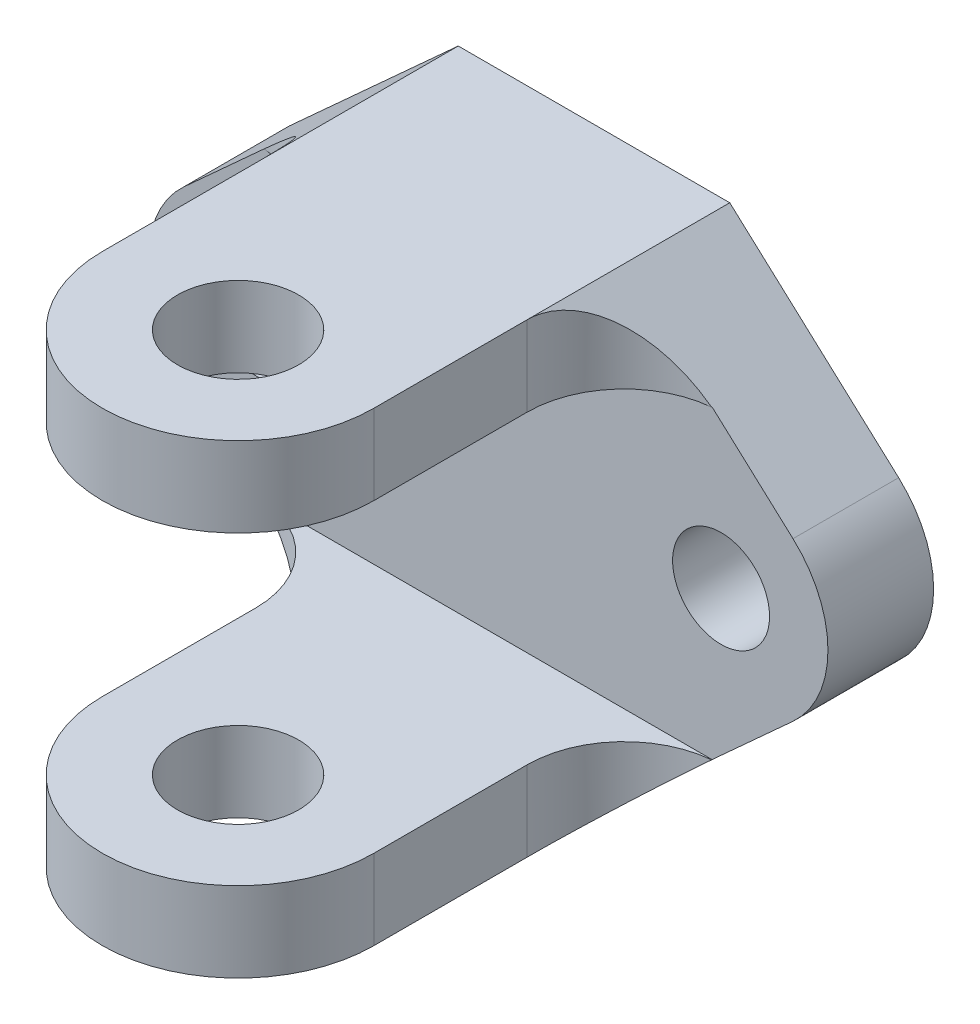
ISO-10303-21;
HEADER;
FILE_DESCRIPTION(('STEP AP214'),'2;1');
FILE_NAME('part.step','',(''),(''),'','','');
FILE_SCHEMA(('AUTOMOTIVE_DESIGN { 1 0 10303 214 1 1 1 1 }'));
ENDSEC;
DATA;
#1=APPLICATION_CONTEXT('core data for automotive mechanical design processes');
#2=APPLICATION_PROTOCOL_DEFINITION('international standard','automotive_design',2000,#1);
#3=PRODUCT_CONTEXT('',#1,'mechanical');
#4=PRODUCT('Part','Part','',(#3));
#5=PRODUCT_RELATED_PRODUCT_CATEGORY('part','',(#4));
#6=PRODUCT_DEFINITION_FORMATION('','',#4);
#7=PRODUCT_DEFINITION_CONTEXT('part definition',#1,'design');
#8=PRODUCT_DEFINITION('design','',#6,#7);
#9=PRODUCT_DEFINITION_SHAPE('','',#8);
#10=(LENGTH_UNIT() NAMED_UNIT(*) SI_UNIT(.MILLI.,.METRE.));
#11=(NAMED_UNIT(*) PLANE_ANGLE_UNIT() SI_UNIT($,.RADIAN.));
#12=(NAMED_UNIT(*) SI_UNIT($,.STERADIAN.) SOLID_ANGLE_UNIT());
#13=UNCERTAINTY_MEASURE_WITH_UNIT(LENGTH_MEASURE(1.E-05),#10,'distance_accuracy_value','');
#14=(GEOMETRIC_REPRESENTATION_CONTEXT(3) GLOBAL_UNCERTAINTY_ASSIGNED_CONTEXT((#13)) GLOBAL_UNIT_ASSIGNED_CONTEXT((#10,
#11,#12)) REPRESENTATION_CONTEXT('',''));
#15=CARTESIAN_POINT('',(0.,0.,0.));
#16=DIRECTION('',(0.,0.,1.));
#17=DIRECTION('',(1.,0.,0.));
#18=AXIS2_PLACEMENT_3D('',#15,#16,#17);
#19=CARTESIAN_POINT('',(-8.89,-85.7339032824825,0.));
#20=DIRECTION('',(1.,0.,0.));
#21=DIRECTION('',(0.,0.,-1.));
#22=AXIS2_PLACEMENT_3D('',#19,#20,#21);
#23=PLANE('',#22);
#24=DIRECTION('',(0.,0.,1.));
#25=VECTOR('',#24,1.);
#26=CARTESIAN_POINT('',(-8.89,15.24,0.));
#27=LINE('',#26,#25);
#28=CARTESIAN_POINT('',(-8.89,15.24,15.81));
#29=VERTEX_POINT('',#28);
#30=CARTESIAN_POINT('',(-8.89,15.24,25.8481308));
#31=VERTEX_POINT('',#30);
#32=EDGE_CURVE('E194',#29,#31,#27,.T.);
#33=ORIENTED_EDGE('',*,*,#32,.F.);
#34=DIRECTION('',(0.,1.,0.));
#35=VECTOR('',#34,1.);
#36=CARTESIAN_POINT('',(-8.89,9.99999999999999,15.81));
#37=LINE('',#36,#35);
#38=CARTESIAN_POINT('',(-8.89,10.,15.81));
#39=VERTEX_POINT('',#38);
#40=EDGE_CURVE('E285',#29,#39,#37,.F.);
#41=ORIENTED_EDGE('',*,*,#40,.T.);
#42=DIRECTION('',(0.,0.,-1.));
#43=VECTOR('',#42,1.);
#44=CARTESIAN_POINT('',(-8.88999999999999,10.,62.46));
#45=LINE('',#44,#43);
#46=CARTESIAN_POINT('',(-8.89,9.99999999999999,25.8481308));
#47=VERTEX_POINT('',#46);
#48=EDGE_CURVE('E230',#47,#39,#45,.T.);
#49=ORIENTED_EDGE('',*,*,#48,.F.);
#50=DIRECTION('',(0.,1.,0.));
#51=VECTOR('',#50,1.);
#52=CARTESIAN_POINT('',(-8.89,-85.7339032824825,25.8481308));
#53=LINE('',#52,#51);
#54=EDGE_CURVE('E208',#47,#31,#53,.T.);
#55=ORIENTED_EDGE('',*,*,#54,.T.);
#56=EDGE_LOOP('',(#33,#41,#49,#55));
#57=FACE_BOUND('',#56,.T.);
#58=ADVANCED_FACE('F43',(#57),#23,.F.);
#59=CARTESIAN_POINT('',(8.89,-85.7339032824825,0.));
#60=DIRECTION('',(1.,0.,0.));
#61=DIRECTION('',(0.,0.,-1.));
#62=AXIS2_PLACEMENT_3D('',#59,#60,#61);
#63=PLANE('',#62);
#64=DIRECTION('',(0.,0.,-1.));
#65=VECTOR('',#64,1.);
#66=CARTESIAN_POINT('',(8.89,10.,62.46));
#67=LINE('',#66,#65);
#68=CARTESIAN_POINT('',(8.89,9.99999999999999,25.8481308));
#69=VERTEX_POINT('',#68);
#70=CARTESIAN_POINT('',(8.89,10.,15.81));
#71=VERTEX_POINT('',#70);
#72=EDGE_CURVE('E234',#69,#71,#67,.T.);
#73=ORIENTED_EDGE('',*,*,#72,.T.);
#74=DIRECTION('',(0.,1.,0.));
#75=VECTOR('',#74,1.);
#76=CARTESIAN_POINT('',(8.89,-85.7339032824825,15.81));
#77=LINE('',#76,#75);
#78=CARTESIAN_POINT('',(8.89,15.24,15.81));
#79=VERTEX_POINT('',#78);
#80=EDGE_CURVE('E293',#71,#79,#77,.T.);
#81=ORIENTED_EDGE('',*,*,#80,.T.);
#82=DIRECTION('',(0.,0.,1.));
#83=VECTOR('',#82,1.);
#84=CARTESIAN_POINT('',(8.89,15.24,0.));
#85=LINE('',#84,#83);
#86=CARTESIAN_POINT('',(8.89,15.24,25.8481308));
#87=VERTEX_POINT('',#86);
#88=EDGE_CURVE('E199',#79,#87,#85,.T.);
#89=ORIENTED_EDGE('',*,*,#88,.T.);
#90=DIRECTION('',(0.,1.,0.));
#91=VECTOR('',#90,1.);
#92=CARTESIAN_POINT('',(8.89,-85.7339032824825,25.8481308));
#93=LINE('',#92,#91);
#94=EDGE_CURVE('E222',#69,#87,#93,.T.);
#95=ORIENTED_EDGE('',*,*,#94,.F.);
#96=EDGE_LOOP('',(#73,#81,#89,#95));
#97=FACE_BOUND('',#96,.T.);
#98=ADVANCED_FACE('F366',(#97),#63,.T.);
#99=CARTESIAN_POINT('',(15.24,0.,43.1490620231552));
#100=DIRECTION('',(0.,0.,-1.));
#101=DIRECTION('',(-1.,0.,0.));
#102=AXIS2_PLACEMENT_3D('',#99,#100,#101);
#103=CYLINDRICAL_SURFACE('',#102,7.);
#104=CARTESIAN_POINT('',(15.24,0.,2.54));
#105=DIRECTION('',(0.,0.,1.));
#106=DIRECTION('',(1.,0.,0.));
#107=AXIS2_PLACEMENT_3D('',#104,#105,#106);
#108=CIRCLE('',#107,7.);
#109=CARTESIAN_POINT('',(19.9505157143423,-5.17793797808881,2.54));
#110=VERTEX_POINT('',#109);
#111=CARTESIAN_POINT('',(19.9505157143423,5.17793797808881,2.54));
#112=VERTEX_POINT('',#111);
#113=EDGE_CURVE('E448',#110,#112,#108,.T.);
#114=ORIENTED_EDGE('',*,*,#113,.T.);
#115=DIRECTION('',(0.,0.,-1.));
#116=VECTOR('',#115,1.);
#117=CARTESIAN_POINT('',(19.9505157143423,5.17793797808881,24.4125950924915));
#118=LINE('',#117,#116);
#119=CARTESIAN_POINT('',(19.9505157143423,5.17793797808881,9.46));
#120=VERTEX_POINT('',#119);
#121=EDGE_CURVE('E428',#120,#112,#118,.T.);
#122=ORIENTED_EDGE('',*,*,#121,.F.);
#123=CARTESIAN_POINT('',(15.24,0.,9.46));
#124=DIRECTION('',(0.,0.,-1.));
#125=DIRECTION('',(-1.,0.,0.));
#126=AXIS2_PLACEMENT_3D('',#123,#124,#125);
#127=CIRCLE('',#126,7.);
#128=CARTESIAN_POINT('',(19.9505157143423,-5.17793797808881,9.46));
#129=VERTEX_POINT('',#128);
#130=EDGE_CURVE('E203',#129,#120,#127,.F.);
#131=ORIENTED_EDGE('',*,*,#130,.F.);
#132=DIRECTION('',(0.,0.,-1.));
#133=VECTOR('',#132,1.);
#134=CARTESIAN_POINT('',(19.9505157143423,-5.17793797808881,24.4125950924915));
#135=LINE('',#134,#133);
#136=EDGE_CURVE('E432',#129,#110,#135,.T.);
#137=ORIENTED_EDGE('',*,*,#136,.T.);
#138=EDGE_LOOP('',(#114,#122,#131,#137));
#139=FACE_BOUND('',#138,.T.);
#140=ADVANCED_FACE('F393',(#139),#103,.T.);
#141=DIRECTION('',(0.,0.,1.));
#142=VECTOR('',#141,1.);
#143=CARTESIAN_POINT('',(-8.88999999999999,-10.,62.46));
#144=LINE('',#143,#142);
#145=CARTESIAN_POINT('',(-8.89,-10.,15.81));
#146=VERTEX_POINT('',#145);
#147=CARTESIAN_POINT('',(-8.89,-10.,25.8481308));
#148=VERTEX_POINT('',#147);
#149=EDGE_CURVE('E268',#146,#148,#144,.T.);
#150=ORIENTED_EDGE('',*,*,#149,.F.);
#151=DIRECTION('',(0.,-1.,0.));
#152=VECTOR('',#151,1.);
#153=CARTESIAN_POINT('',(-8.89,-15.24,15.81));
#154=LINE('',#153,#152);
#155=CARTESIAN_POINT('',(-8.89,-15.24,15.81));
#156=VERTEX_POINT('',#155);
#157=EDGE_CURVE('E281',#146,#156,#154,.T.);
#158=ORIENTED_EDGE('',*,*,#157,.T.);
#159=DIRECTION('',(0.,0.,1.));
#160=VECTOR('',#159,1.);
#161=CARTESIAN_POINT('',(-8.89,-15.24,0.));
#162=LINE('',#161,#160);
#163=CARTESIAN_POINT('',(-8.89,-15.24,25.8481308));
#164=VERTEX_POINT('',#163);
#165=EDGE_CURVE('E217',#156,#164,#162,.T.);
#166=ORIENTED_EDGE('',*,*,#165,.T.);
#167=EDGE_CURVE('E223',#164,#148,#53,.T.);
#168=ORIENTED_EDGE('',*,*,#167,.T.);
#169=EDGE_LOOP('',(#150,#158,#166,#168));
#170=FACE_BOUND('',#169,.T.);
#171=ADVANCED_FACE('F389',(#170),#23,.F.);
#172=CARTESIAN_POINT('',(-15.24,0.,43.1490620231552));
#173=DIRECTION('',(0.,0.,-1.));
#174=DIRECTION('',(-1.,0.,0.));
#175=AXIS2_PLACEMENT_3D('',#172,#173,#174);
#176=CYLINDRICAL_SURFACE('',#175,7.);
#177=DIRECTION('',(0.,0.,-1.));
#178=VECTOR('',#177,1.);
#179=CARTESIAN_POINT('',(-19.9505157143423,5.17793797808881,24.4125950924915));
#180=LINE('',#179,#178);
#181=CARTESIAN_POINT('',(-19.9505157143423,5.17793797808881,9.46));
#182=VERTEX_POINT('',#181);
#183=CARTESIAN_POINT('',(-19.9505157143423,5.17793797808881,2.54));
#184=VERTEX_POINT('',#183);
#185=EDGE_CURVE('E452',#182,#184,#180,.T.);
#186=ORIENTED_EDGE('',*,*,#185,.T.);
#187=CARTESIAN_POINT('',(-15.24,0.,2.54));
#188=DIRECTION('',(0.,0.,1.));
#189=DIRECTION('',(1.,0.,0.));
#190=AXIS2_PLACEMENT_3D('',#187,#188,#189);
#191=CIRCLE('',#190,7.);
#192=CARTESIAN_POINT('',(-19.9505157143423,-5.1779379780888,2.54));
#193=VERTEX_POINT('',#192);
#194=EDGE_CURVE('E59',#184,#193,#191,.T.);
#195=ORIENTED_EDGE('',*,*,#194,.T.);
#196=DIRECTION('',(0.,0.,-1.));
#197=VECTOR('',#196,1.);
#198=CARTESIAN_POINT('',(-19.9505157143423,-5.17793797808881,24.4125950924915));
#199=LINE('',#198,#197);
#200=CARTESIAN_POINT('',(-19.9505157143423,-5.17793797808881,9.46));
#201=VERTEX_POINT('',#200);
#202=EDGE_CURVE('E427',#201,#193,#199,.T.);
#203=ORIENTED_EDGE('',*,*,#202,.F.);
#204=CARTESIAN_POINT('',(-15.24,0.,9.46));
#205=DIRECTION('',(0.,0.,-1.));
#206=DIRECTION('',(-1.,0.,0.));
#207=AXIS2_PLACEMENT_3D('',#204,#205,#206);
#208=CIRCLE('',#207,7.);
#209=EDGE_CURVE('E201',#201,#182,#208,.T.);
#210=ORIENTED_EDGE('',*,*,#209,.T.);
#211=EDGE_LOOP('',(#186,#195,#203,#210));
#212=FACE_BOUND('',#211,.T.);
#213=ADVANCED_FACE('F397',(#212),#176,.T.);
#214=DIRECTION('',(0.,0.,1.));
#215=VECTOR('',#214,1.);
#216=CARTESIAN_POINT('',(8.89,-15.24,0.));
#217=LINE('',#216,#215);
#218=CARTESIAN_POINT('',(8.89,-15.24,15.81));
#219=VERTEX_POINT('',#218);
#220=CARTESIAN_POINT('',(8.89,-15.24,25.8481308));
#221=VERTEX_POINT('',#220);
#222=EDGE_CURVE('E213',#219,#221,#217,.T.);
#223=ORIENTED_EDGE('',*,*,#222,.F.);
#224=DIRECTION('',(0.,-1.,0.));
#225=VECTOR('',#224,1.);
#226=CARTESIAN_POINT('',(8.89,-85.7339032824825,15.81));
#227=LINE('',#226,#225);
#228=CARTESIAN_POINT('',(8.89,-9.99999999999999,15.81));
#229=VERTEX_POINT('',#228);
#230=EDGE_CURVE('E289',#219,#229,#227,.F.);
#231=ORIENTED_EDGE('',*,*,#230,.T.);
#232=DIRECTION('',(0.,0.,1.));
#233=VECTOR('',#232,1.);
#234=CARTESIAN_POINT('',(8.89,-9.99999999999999,62.46));
#235=LINE('',#234,#233);
#236=CARTESIAN_POINT('',(8.89,-9.99999999999999,25.8481308));
#237=VERTEX_POINT('',#236);
#238=EDGE_CURVE('E278',#229,#237,#235,.T.);
#239=ORIENTED_EDGE('',*,*,#238,.T.);
#240=EDGE_CURVE('E218',#221,#237,#93,.T.);
#241=ORIENTED_EDGE('',*,*,#240,.F.);
#242=EDGE_LOOP('',(#223,#231,#239,#241));
#243=FACE_BOUND('',#242,.T.);
#244=ADVANCED_FACE('F343',(#243),#63,.T.);
#245=CARTESIAN_POINT('',(-23.24,10.,62.46));
#246=DIRECTION('',(0.,1.,0.));
#247=DIRECTION('',(0.,0.,1.));
#248=AXIS2_PLACEMENT_3D('',#245,#246,#247);
#249=PLANE('',#248);
#250=CARTESIAN_POINT('',(0.,10.,25.8481308));
#251=DIRECTION('',(0.,1.,0.));
#252=DIRECTION('',(0.,0.,1.));
#253=AXIS2_PLACEMENT_3D('',#250,#251,#252);
#254=CIRCLE('',#253,3.96875);
#255=CARTESIAN_POINT('',(0.,9.99999999999999,29.8168808));
#256=VERTEX_POINT('',#255);
#257=EDGE_CURVE('E250',#256,#256,#254,.T.);
#258=ORIENTED_EDGE('',*,*,#257,.T.);
#259=EDGE_LOOP('',(#258));
#260=FACE_BOUND('',#259,.T.);
#261=ORIENTED_EDGE('',*,*,#72,.F.);
#262=CARTESIAN_POINT('',(0.,9.99999999999999,25.8481308));
#263=DIRECTION('',(0.,1.,0.));
#264=DIRECTION('',(0.,0.,1.));
#265=AXIS2_PLACEMENT_3D('',#262,#263,#264);
#266=CIRCLE('',#265,8.89);
#267=EDGE_CURVE('E238',#47,#69,#266,.T.);
#268=ORIENTED_EDGE('',*,*,#267,.F.);
#269=ORIENTED_EDGE('',*,*,#48,.T.);
#270=CARTESIAN_POINT('',(-15.24,10.,15.81));
#271=DIRECTION('',(0.,1.,0.));
#272=DIRECTION('',(0.,0.,1.));
#273=AXIS2_PLACEMENT_3D('',#270,#271,#272);
#274=CIRCLE('',#273,6.35);
#275=CARTESIAN_POINT('',(-14.6499627409318,10.,9.48747233830398));
#276=VERTEX_POINT('',#275);
#277=EDGE_CURVE('E305',#39,#276,#274,.T.);
#278=ORIENTED_EDGE('',*,*,#277,.T.);
#279=DIRECTION('',(0.,0.,1.));
#280=VECTOR('',#279,1.);
#281=CARTESIAN_POINT('',(-14.6499627409318,10.,24.4125950924915));
#282=LINE('',#281,#280);
#283=CARTESIAN_POINT('',(-14.6499627409318,10.,9.46));
#284=VERTEX_POINT('',#283);
#285=EDGE_CURVE('E320',#284,#276,#282,.T.);
#286=ORIENTED_EDGE('',*,*,#285,.F.);
#287=DIRECTION('',(1.,0.,0.));
#288=VECTOR('',#287,1.);
#289=CARTESIAN_POINT('',(-23.24,10.,9.46));
#290=LINE('',#289,#288);
#291=CARTESIAN_POINT('',(14.6499627409318,10.,9.46));
#292=VERTEX_POINT('',#291);
#293=EDGE_CURVE('E257',#284,#292,#290,.T.);
#294=ORIENTED_EDGE('',*,*,#293,.T.);
#295=DIRECTION('',(0.,0.,-1.));
#296=VECTOR('',#295,1.);
#297=CARTESIAN_POINT('',(14.6499627409318,10.,62.46));
#298=LINE('',#297,#296);
#299=CARTESIAN_POINT('',(14.6499627409318,9.99999999999999,9.48747233830398));
#300=VERTEX_POINT('',#299);
#301=EDGE_CURVE('E11',#292,#300,#298,.F.);
#302=ORIENTED_EDGE('',*,*,#301,.T.);
#303=CARTESIAN_POINT('',(15.24,9.99999999999999,15.81));
#304=DIRECTION('',(0.,1.,0.));
#305=DIRECTION('',(0.,0.,1.));
#306=AXIS2_PLACEMENT_3D('',#303,#304,#305);
#307=CIRCLE('',#306,6.35);
#308=EDGE_CURVE('E317',#300,#71,#307,.T.);
#309=ORIENTED_EDGE('',*,*,#308,.T.);
#310=EDGE_LOOP('',(#261,#268,#269,#278,#286,#294,#302,#309));
#311=FACE_BOUND('',#310,.T.);
#312=ADVANCED_FACE('F376',(#260,#311),#249,.F.);
#313=CARTESIAN_POINT('',(-23.24,-10.,62.46));
#314=DIRECTION('',(0.,-1.,0.));
#315=DIRECTION('',(1.,0.,0.));
#316=AXIS2_PLACEMENT_3D('',#313,#314,#315);
#317=PLANE('',#316);
#318=CARTESIAN_POINT('',(0.,-9.99999999999999,25.8481308));
#319=DIRECTION('',(0.,-1.,0.));
#320=DIRECTION('',(1.,0.,0.));
#321=AXIS2_PLACEMENT_3D('',#318,#319,#320);
#322=CIRCLE('',#321,3.96875);
#323=CARTESIAN_POINT('',(0.,-9.99999999999999,29.8168808));
#324=VERTEX_POINT('',#323);
#325=EDGE_CURVE('E249',#324,#324,#322,.T.);
#326=ORIENTED_EDGE('',*,*,#325,.T.);
#327=EDGE_LOOP('',(#326));
#328=FACE_BOUND('',#327,.T.);
#329=ORIENTED_EDGE('',*,*,#238,.F.);
#330=CARTESIAN_POINT('',(15.24,-9.99999999999999,15.81));
#331=DIRECTION('',(0.,-1.,0.));
#332=DIRECTION('',(1.,0.,0.));
#333=AXIS2_PLACEMENT_3D('',#330,#331,#332);
#334=CIRCLE('',#333,6.35);
#335=CARTESIAN_POINT('',(14.6499627409318,-9.99999999999999,9.48747233830398));
#336=VERTEX_POINT('',#335);
#337=EDGE_CURVE('E312',#229,#336,#334,.T.);
#338=ORIENTED_EDGE('',*,*,#337,.T.);
#339=DIRECTION('',(0.,0.,1.));
#340=VECTOR('',#339,1.);
#341=CARTESIAN_POINT('',(14.6499627409318,-9.99999999999999,24.4125950924915));
#342=LINE('',#341,#340);
#343=CARTESIAN_POINT('',(14.6499627409318,-9.99999999999999,9.46));
#344=VERTEX_POINT('',#343);
#345=EDGE_CURVE('E324',#344,#336,#342,.T.);
#346=ORIENTED_EDGE('',*,*,#345,.F.);
#347=DIRECTION('',(-1.,0.,0.));
#348=VECTOR('',#347,1.);
#349=CARTESIAN_POINT('',(-23.24,-10.,9.46));
#350=LINE('',#349,#348);
#351=CARTESIAN_POINT('',(-14.6499627409318,-10.,9.46));
#352=VERTEX_POINT('',#351);
#353=EDGE_CURVE('E254',#344,#352,#350,.T.);
#354=ORIENTED_EDGE('',*,*,#353,.T.);
#355=DIRECTION('',(0.,0.,-1.));
#356=VECTOR('',#355,1.);
#357=CARTESIAN_POINT('',(-14.6499627409318,-10.,62.46));
#358=LINE('',#357,#356);
#359=CARTESIAN_POINT('',(-14.6499627409318,-10.,9.48747233830398));
#360=VERTEX_POINT('',#359);
#361=EDGE_CURVE('E52',#352,#360,#358,.F.);
#362=ORIENTED_EDGE('',*,*,#361,.T.);
#363=CARTESIAN_POINT('',(-15.24,-10.,15.81));
#364=DIRECTION('',(0.,-1.,0.));
#365=DIRECTION('',(1.,0.,0.));
#366=AXIS2_PLACEMENT_3D('',#363,#364,#365);
#367=CIRCLE('',#366,6.35);
#368=EDGE_CURVE('E300',#360,#146,#367,.T.);
#369=ORIENTED_EDGE('',*,*,#368,.T.);
#370=ORIENTED_EDGE('',*,*,#149,.T.);
#371=CARTESIAN_POINT('',(0.,-9.99999999999999,25.8481308));
#372=DIRECTION('',(0.,-1.,0.));
#373=DIRECTION('',(1.,0.,0.));
#374=AXIS2_PLACEMENT_3D('',#371,#372,#373);
#375=CIRCLE('',#374,8.89);
#376=EDGE_CURVE('E274',#237,#148,#375,.T.);
#377=ORIENTED_EDGE('',*,*,#376,.F.);
#378=EDGE_LOOP('',(#329,#338,#346,#354,#362,#369,#370,#377));
#379=FACE_BOUND('',#378,.T.);
#380=ADVANCED_FACE('F346',(#328,#379),#317,.F.);
#381=CARTESIAN_POINT('',(0.,0.,9.46));
#382=DIRECTION('',(0.,0.,-1.));
#383=DIRECTION('',(-1.,0.,0.));
#384=AXIS2_PLACEMENT_3D('',#381,#382,#383);
#385=PLANE('',#384);
#386=DIRECTION('',(0.739705425441259,-0.672930816334611,0.));
#387=VECTOR('',#386,1.);
#388=CARTESIAN_POINT('',(-11.6117345799912,-12.7639615531182,9.46));
#389=LINE('',#388,#387);
#390=EDGE_CURVE('E423',#201,#352,#389,.T.);
#391=ORIENTED_EDGE('',*,*,#390,.T.);
#392=ORIENTED_EDGE('',*,*,#353,.F.);
#393=DIRECTION('',(-0.739705425441259,-0.672930816334611,0.));
#394=VECTOR('',#393,1.);
#395=CARTESIAN_POINT('',(11.6117345799912,-12.7639615531182,9.46));
#396=LINE('',#395,#394);
#397=EDGE_CURVE('E336',#129,#344,#396,.T.);
#398=ORIENTED_EDGE('',*,*,#397,.F.);
#399=ORIENTED_EDGE('',*,*,#130,.T.);
#400=DIRECTION('',(-0.739705425441259,0.672930816334611,0.));
#401=VECTOR('',#400,1.);
#402=CARTESIAN_POINT('',(8.89,15.24,9.46));
#403=LINE('',#402,#401);
#404=EDGE_CURVE('E435',#120,#292,#403,.T.);
#405=ORIENTED_EDGE('',*,*,#404,.T.);
#406=ORIENTED_EDGE('',*,*,#293,.F.);
#407=DIRECTION('',(0.739705425441259,0.672930816334612,0.));
#408=VECTOR('',#407,1.);
#409=CARTESIAN_POINT('',(-8.89,15.24,9.46));
#410=LINE('',#409,#408);
#411=EDGE_CURVE('E455',#182,#284,#410,.T.);
#412=ORIENTED_EDGE('',*,*,#411,.F.);
#413=ORIENTED_EDGE('',*,*,#209,.F.);
#414=EDGE_LOOP('',(#391,#392,#398,#399,#405,#406,#412,#413));
#415=FACE_BOUND('',#414,.T.);
#416=CARTESIAN_POINT('',(15.24,0.,9.46));
#417=DIRECTION('',(0.,0.,1.));
#418=DIRECTION('',(1.,0.,0.));
#419=AXIS2_PLACEMENT_3D('',#416,#417,#418);
#420=CIRCLE('',#419,3.175);
#421=CARTESIAN_POINT('',(18.415,0.,9.46));
#422=VERTEX_POINT('',#421);
#423=EDGE_CURVE('E264',#422,#422,#420,.T.);
#424=ORIENTED_EDGE('',*,*,#423,.F.);
#425=EDGE_LOOP('',(#424));
#426=FACE_BOUND('',#425,.T.);
#427=CARTESIAN_POINT('',(-15.24,0.,9.46));
#428=DIRECTION('',(0.,0.,1.));
#429=DIRECTION('',(1.,0.,0.));
#430=AXIS2_PLACEMENT_3D('',#427,#428,#429);
#431=CIRCLE('',#430,3.175);
#432=CARTESIAN_POINT('',(-12.065,0.,9.46));
#433=VERTEX_POINT('',#432);
#434=EDGE_CURVE('E260',#433,#433,#431,.T.);
#435=ORIENTED_EDGE('',*,*,#434,.F.);
#436=EDGE_LOOP('',(#435));
#437=FACE_BOUND('',#436,.T.);
#438=ADVANCED_FACE('F419',(#415,#426,#437),#385,.F.);
#439=CARTESIAN_POINT('',(-23.24,15.24,9.46));
#440=DIRECTION('',(0.,-1.,0.));
#441=DIRECTION('',(0.,0.,-1.));
#442=AXIS2_PLACEMENT_3D('',#439,#440,#441);
#443=PLANE('',#442);
#444=CARTESIAN_POINT('',(0.,15.24,25.8481308));
#445=DIRECTION('',(0.,-1.,0.));
#446=DIRECTION('',(0.,0.,-1.));
#447=AXIS2_PLACEMENT_3D('',#444,#445,#446);
#448=CIRCLE('',#447,3.96875);
#449=CARTESIAN_POINT('',(0.,15.24,29.8168808));
#450=VERTEX_POINT('',#449);
#451=EDGE_CURVE('E241',#450,#450,#448,.T.);
#452=ORIENTED_EDGE('',*,*,#451,.T.);
#453=EDGE_LOOP('',(#452));
#454=FACE_BOUND('',#453,.T.);
#455=CARTESIAN_POINT('',(8.89,15.24,2.54));
#456=VERTEX_POINT('',#455);
#457=EDGE_CURVE('E183',#456,#79,#85,.T.);
#458=ORIENTED_EDGE('',*,*,#457,.F.);
#459=DIRECTION('',(-1.,0.,0.));
#460=VECTOR('',#459,1.);
#461=CARTESIAN_POINT('',(8.89,15.24,2.54));
#462=LINE('',#461,#460);
#463=CARTESIAN_POINT('',(-8.89,15.24,2.54));
#464=VERTEX_POINT('',#463);
#465=EDGE_CURVE('E169',#456,#464,#462,.T.);
#466=ORIENTED_EDGE('',*,*,#465,.T.);
#467=EDGE_CURVE('E180',#464,#29,#27,.T.);
#468=ORIENTED_EDGE('',*,*,#467,.T.);
#469=ORIENTED_EDGE('',*,*,#32,.T.);
#470=CARTESIAN_POINT('',(0.,15.24,25.8481308));
#471=DIRECTION('',(0.,-1.,0.));
#472=DIRECTION('',(0.,0.,-1.));
#473=AXIS2_PLACEMENT_3D('',#470,#471,#472);
#474=CIRCLE('',#473,8.89);
#475=EDGE_CURVE('E193',#87,#31,#474,.T.);
#476=ORIENTED_EDGE('',*,*,#475,.F.);
#477=ORIENTED_EDGE('',*,*,#88,.F.);
#478=EDGE_LOOP('',(#458,#466,#468,#469,#476,#477));
#479=FACE_BOUND('',#478,.T.);
#480=ADVANCED_FACE('F179',(#454,#479),#443,.F.);
#481=CARTESIAN_POINT('',(-23.24,-15.24,9.46));
#482=DIRECTION('',(0.,1.,0.));
#483=DIRECTION('',(0.,0.,1.));
#484=AXIS2_PLACEMENT_3D('',#481,#482,#483);
#485=PLANE('',#484);
#486=CARTESIAN_POINT('',(-8.89,-15.24,2.54));
#487=VERTEX_POINT('',#486);
#488=EDGE_CURVE('E227',#487,#156,#162,.T.);
#489=ORIENTED_EDGE('',*,*,#488,.F.);
#490=DIRECTION('',(1.,0.,0.));
#491=VECTOR('',#490,1.);
#492=CARTESIAN_POINT('',(-8.89,-15.24,2.54));
#493=LINE('',#492,#491);
#494=CARTESIAN_POINT('',(8.89,-15.24,2.54));
#495=VERTEX_POINT('',#494);
#496=EDGE_CURVE('E477',#487,#495,#493,.T.);
#497=ORIENTED_EDGE('',*,*,#496,.T.);
#498=EDGE_CURVE('E209',#495,#219,#217,.T.);
#499=ORIENTED_EDGE('',*,*,#498,.T.);
#500=ORIENTED_EDGE('',*,*,#222,.T.);
#501=CARTESIAN_POINT('',(0.,-15.24,25.8481308));
#502=DIRECTION('',(0.,1.,0.));
#503=DIRECTION('',(0.,0.,1.));
#504=AXIS2_PLACEMENT_3D('',#501,#502,#503);
#505=CIRCLE('',#504,8.89);
#506=EDGE_CURVE('E212',#221,#164,#505,.F.);
#507=ORIENTED_EDGE('',*,*,#506,.T.);
#508=ORIENTED_EDGE('',*,*,#165,.F.);
#509=EDGE_LOOP('',(#489,#497,#499,#500,#507,#508));
#510=FACE_BOUND('',#509,.T.);
#511=CARTESIAN_POINT('',(0.,-15.24,25.8481308));
#512=DIRECTION('',(0.,1.,0.));
#513=DIRECTION('',(0.,0.,1.));
#514=AXIS2_PLACEMENT_3D('',#511,#512,#513);
#515=CIRCLE('',#514,3.96875);
#516=CARTESIAN_POINT('',(0.,-15.24,29.8168808));
#517=VERTEX_POINT('',#516);
#518=EDGE_CURVE('E245',#517,#517,#515,.F.);
#519=ORIENTED_EDGE('',*,*,#518,.F.);
#520=EDGE_LOOP('',(#519));
#521=FACE_BOUND('',#520,.T.);
#522=ADVANCED_FACE('F355',(#510,#521),#485,.F.);
#523=CARTESIAN_POINT('',(15.24,0.,9.46));
#524=DIRECTION('',(0.,0.,-1.));
#525=DIRECTION('',(-1.,0.,0.));
#526=AXIS2_PLACEMENT_3D('',#523,#524,#525);
#527=CYLINDRICAL_SURFACE('',#526,3.175);
#528=CARTESIAN_POINT('',(15.24,0.,2.54));
#529=DIRECTION('',(0.,0.,1.));
#530=DIRECTION('',(1.,0.,0.));
#531=AXIS2_PLACEMENT_3D('',#528,#529,#530);
#532=CIRCLE('',#531,3.175);
#533=CARTESIAN_POINT('',(18.415,0.,2.54));
#534=VERTEX_POINT('',#533);
#535=EDGE_CURVE('E460',#534,#534,#532,.T.);
#536=ORIENTED_EDGE('',*,*,#535,.F.);
#537=EDGE_LOOP('',(#536));
#538=FACE_BOUND('',#537,.T.);
#539=ORIENTED_EDGE('',*,*,#423,.T.);
#540=EDGE_LOOP('',(#539));
#541=FACE_BOUND('',#540,.T.);
#542=ADVANCED_FACE('F498',(#538,#541),#527,.F.);
#543=CARTESIAN_POINT('',(-15.24,0.,9.46));
#544=DIRECTION('',(0.,0.,-1.));
#545=DIRECTION('',(-1.,0.,0.));
#546=AXIS2_PLACEMENT_3D('',#543,#544,#545);
#547=CYLINDRICAL_SURFACE('',#546,3.175);
#548=CARTESIAN_POINT('',(-15.24,0.,2.54));
#549=DIRECTION('',(0.,0.,1.));
#550=DIRECTION('',(1.,0.,0.));
#551=AXIS2_PLACEMENT_3D('',#548,#549,#550);
#552=CIRCLE('',#551,3.175);
#553=CARTESIAN_POINT('',(-12.065,0.,2.54));
#554=VERTEX_POINT('',#553);
#555=EDGE_CURVE('E465',#554,#554,#552,.T.);
#556=ORIENTED_EDGE('',*,*,#555,.F.);
#557=EDGE_LOOP('',(#556));
#558=FACE_BOUND('',#557,.T.);
#559=ORIENTED_EDGE('',*,*,#434,.T.);
#560=EDGE_LOOP('',(#559));
#561=FACE_BOUND('',#560,.T.);
#562=ADVANCED_FACE('F503',(#558,#561),#547,.F.);
#563=CARTESIAN_POINT('',(0.,-26.4653201513364,25.8481308));
#564=DIRECTION('',(0.,1.,0.));
#565=DIRECTION('',(0.,0.,1.));
#566=AXIS2_PLACEMENT_3D('',#563,#564,#565);
#567=CYLINDRICAL_SURFACE('',#566,3.96875);
#568=CARTESIAN_POINT('',(0.,-15.24,29.8168808));
#569=CARTESIAN_POINT('',(0.,-15.1854166666667,29.8168808));
#570=CARTESIAN_POINT('',(0.,-15.1308333333333,29.8168808));
#571=CARTESIAN_POINT('',(0.,-15.0216666666667,29.8168808));
#572=CARTESIAN_POINT('',(0.,-14.9670833333333,29.8168808));
#573=CARTESIAN_POINT('',(0.,-14.8579166666667,29.8168808));
#574=CARTESIAN_POINT('',(0.,-14.8033333333333,29.8168808));
#575=CARTESIAN_POINT('',(0.,-14.6941666666667,29.8168808));
#576=CARTESIAN_POINT('',(0.,-14.6395833333333,29.8168808));
#577=CARTESIAN_POINT('',(0.,-14.5304166666667,29.8168808));
#578=CARTESIAN_POINT('',(0.,-14.4758333333333,29.8168808));
#579=CARTESIAN_POINT('',(0.,-14.3666666666667,29.8168808));
#580=CARTESIAN_POINT('',(0.,-14.3120833333333,29.8168808));
#581=CARTESIAN_POINT('',(0.,-14.2029166666667,29.8168808));
#582=CARTESIAN_POINT('',(0.,-14.1483333333333,29.8168808));
#583=CARTESIAN_POINT('',(0.,-14.0391666666667,29.8168808));
#584=CARTESIAN_POINT('',(0.,-13.9845833333333,29.8168808));
#585=CARTESIAN_POINT('',(0.,-13.8754166666667,29.8168808));
#586=CARTESIAN_POINT('',(0.,-13.8208333333333,29.8168808));
#587=CARTESIAN_POINT('',(0.,-13.7116666666667,29.8168808));
#588=CARTESIAN_POINT('',(0.,-13.6570833333333,29.8168808));
#589=CARTESIAN_POINT('',(0.,-13.5479166666667,29.8168808));
#590=CARTESIAN_POINT('',(0.,-13.4933333333333,29.8168808));
#591=CARTESIAN_POINT('',(0.,-13.3841666666667,29.8168808));
#592=CARTESIAN_POINT('',(0.,-13.3295833333333,29.8168808));
#593=CARTESIAN_POINT('',(0.,-13.2204166666667,29.8168808));
#594=CARTESIAN_POINT('',(0.,-13.1658333333333,29.8168808));
#595=CARTESIAN_POINT('',(0.,-13.0566666666667,29.8168808));
#596=CARTESIAN_POINT('',(0.,-13.0020833333333,29.8168808));
#597=CARTESIAN_POINT('',(0.,-12.8929166666667,29.8168808));
#598=CARTESIAN_POINT('',(0.,-12.8383333333333,29.8168808));
#599=CARTESIAN_POINT('',(0.,-12.7291666666667,29.8168808));
#600=CARTESIAN_POINT('',(0.,-12.6745833333333,29.8168808));
#601=CARTESIAN_POINT('',(0.,-12.5654166666667,29.8168808));
#602=CARTESIAN_POINT('',(0.,-12.5108333333333,29.8168808));
#603=CARTESIAN_POINT('',(0.,-12.4016666666667,29.8168808));
#604=CARTESIAN_POINT('',(0.,-12.3470833333333,29.8168808));
#605=CARTESIAN_POINT('',(0.,-12.2379166666667,29.8168808));
#606=CARTESIAN_POINT('',(0.,-12.1833333333333,29.8168808));
#607=CARTESIAN_POINT('',(0.,-12.0741666666667,29.8168808));
#608=CARTESIAN_POINT('',(0.,-12.0195833333333,29.8168808));
#609=CARTESIAN_POINT('',(0.,-11.9104166666667,29.8168808));
#610=CARTESIAN_POINT('',(0.,-11.8558333333333,29.8168808));
#611=CARTESIAN_POINT('',(0.,-11.7466666666667,29.8168808));
#612=CARTESIAN_POINT('',(0.,-11.6920833333333,29.8168808));
#613=CARTESIAN_POINT('',(0.,-11.5829166666667,29.8168808));
#614=CARTESIAN_POINT('',(0.,-11.5283333333333,29.8168808));
#615=CARTESIAN_POINT('',(0.,-11.4191666666667,29.8168808));
#616=CARTESIAN_POINT('',(0.,-11.3645833333333,29.8168808));
#617=CARTESIAN_POINT('',(0.,-11.2554166666667,29.8168808));
#618=CARTESIAN_POINT('',(0.,-11.2008333333333,29.8168808));
#619=CARTESIAN_POINT('',(0.,-11.0916666666667,29.8168808));
#620=CARTESIAN_POINT('',(0.,-11.0370833333333,29.8168808));
#621=CARTESIAN_POINT('',(0.,-10.9279166666667,29.8168808));
#622=CARTESIAN_POINT('',(0.,-10.8733333333333,29.8168808));
#623=CARTESIAN_POINT('',(0.,-10.7641666666667,29.8168808));
#624=CARTESIAN_POINT('',(0.,-10.7095833333333,29.8168808));
#625=CARTESIAN_POINT('',(0.,-10.6004166666667,29.8168808));
#626=CARTESIAN_POINT('',(0.,-10.5458333333333,29.8168808));
#627=CARTESIAN_POINT('',(0.,-10.4366666666667,29.8168808));
#628=CARTESIAN_POINT('',(0.,-10.3820833333333,29.8168808));
#629=CARTESIAN_POINT('',(0.,-10.2729166666667,29.8168808));
#630=CARTESIAN_POINT('',(0.,-10.2183333333333,29.8168808));
#631=CARTESIAN_POINT('',(0.,-10.1091666666667,29.8168808));
#632=CARTESIAN_POINT('',(0.,-10.0545833333333,29.8168808));
#633=CARTESIAN_POINT('',(0.,-9.99999999999999,29.8168808));
#634=B_SPLINE_CURVE_WITH_KNOTS('',3,(#568,#569,#570,#571,#572,#573,#574,#575,#576,#577,#578,
#579,#580,#581,#582,#583,#584,#585,#586,#587,#588,#589,#590,#591,#592,#593,#594,#595,#596,#597,
#598,#599,#600,#601,#602,#603,#604,#605,#606,#607,#608,#609,#610,#611,#612,#613,#614,#615,#616,
#617,#618,#619,#620,#621,#622,#623,#624,#625,#626,#627,#628,#629,#630,#631,#632,#633),
.UNSPECIFIED.,.F.,.F.,(4,2,2,2,2,2,2,2,2,2,2,2,2,2,2,2,2,2,2,2,2,2,2,2,2,2,2,2,2,2,2,2,4),(0.,
0.163750000000001,0.327500000000001,0.49125,0.655000000000001,0.818750000000002,
0.982500000000002,1.14625,1.31,1.47375,1.6375,1.80125,1.965,2.12875000000001,2.29250000000001,
2.45625000000001,2.62000000000001,2.78375000000001,2.94750000000001,3.11125000000001,
3.27500000000001,3.43875000000001,3.60250000000001,3.76625000000001,3.93000000000001,
4.09375000000001,4.25750000000001,4.42125000000001,4.58500000000001,4.74875000000001,
4.91250000000001,5.07625000000001,5.24000000000001),.UNSPECIFIED.);
#635=EDGE_CURVE('BSEAM507',#517,#324,#634,.T.);
#636=ORIENTED_EDGE('',*,*,#518,.T.);
#637=ORIENTED_EDGE('',*,*,#325,.F.);
#638=ORIENTED_EDGE('',*,*,#635,.T.);
#639=ORIENTED_EDGE('',*,*,#635,.F.);
#640=EDGE_LOOP('',(#636,#638,#637,#639));
#641=FACE_BOUND('',#640,.T.);
#642=ADVANCED_FACE('F507',(#641),#567,.F.);
#643=CARTESIAN_POINT('',(0.,15.24,29.8168808));
#644=CARTESIAN_POINT('',(0.,15.1854166666667,29.8168808));
#645=CARTESIAN_POINT('',(0.,15.1308333333333,29.8168808));
#646=CARTESIAN_POINT('',(0.,15.0216666666667,29.8168808));
#647=CARTESIAN_POINT('',(0.,14.9670833333333,29.8168808));
#648=CARTESIAN_POINT('',(0.,14.8579166666667,29.8168808));
#649=CARTESIAN_POINT('',(0.,14.8033333333333,29.8168808));
#650=CARTESIAN_POINT('',(0.,14.6941666666667,29.8168808));
#651=CARTESIAN_POINT('',(0.,14.6395833333333,29.8168808));
#652=CARTESIAN_POINT('',(0.,14.5304166666667,29.8168808));
#653=CARTESIAN_POINT('',(0.,14.4758333333333,29.8168808));
#654=CARTESIAN_POINT('',(0.,14.3666666666667,29.8168808));
#655=CARTESIAN_POINT('',(0.,14.3120833333333,29.8168808));
#656=CARTESIAN_POINT('',(0.,14.2029166666667,29.8168808));
#657=CARTESIAN_POINT('',(0.,14.1483333333333,29.8168808));
#658=CARTESIAN_POINT('',(0.,14.0391666666667,29.8168808));
#659=CARTESIAN_POINT('',(0.,13.9845833333333,29.8168808));
#660=CARTESIAN_POINT('',(0.,13.8754166666667,29.8168808));
#661=CARTESIAN_POINT('',(0.,13.8208333333333,29.8168808));
#662=CARTESIAN_POINT('',(0.,13.7116666666667,29.8168808));
#663=CARTESIAN_POINT('',(0.,13.6570833333333,29.8168808));
#664=CARTESIAN_POINT('',(0.,13.5479166666667,29.8168808));
#665=CARTESIAN_POINT('',(0.,13.4933333333333,29.8168808));
#666=CARTESIAN_POINT('',(0.,13.3841666666667,29.8168808));
#667=CARTESIAN_POINT('',(0.,13.3295833333333,29.8168808));
#668=CARTESIAN_POINT('',(0.,13.2204166666667,29.8168808));
#669=CARTESIAN_POINT('',(0.,13.1658333333333,29.8168808));
#670=CARTESIAN_POINT('',(0.,13.0566666666667,29.8168808));
#671=CARTESIAN_POINT('',(0.,13.0020833333333,29.8168808));
#672=CARTESIAN_POINT('',(0.,12.8929166666667,29.8168808));
#673=CARTESIAN_POINT('',(0.,12.8383333333333,29.8168808));
#674=CARTESIAN_POINT('',(0.,12.7291666666667,29.8168808));
#675=CARTESIAN_POINT('',(0.,12.6745833333333,29.8168808));
#676=CARTESIAN_POINT('',(0.,12.5654166666667,29.8168808));
#677=CARTESIAN_POINT('',(0.,12.5108333333333,29.8168808));
#678=CARTESIAN_POINT('',(0.,12.4016666666667,29.8168808));
#679=CARTESIAN_POINT('',(0.,12.3470833333333,29.8168808));
#680=CARTESIAN_POINT('',(0.,12.2379166666667,29.8168808));
#681=CARTESIAN_POINT('',(0.,12.1833333333333,29.8168808));
#682=CARTESIAN_POINT('',(0.,12.0741666666667,29.8168808));
#683=CARTESIAN_POINT('',(0.,12.0195833333333,29.8168808));
#684=CARTESIAN_POINT('',(0.,11.9104166666667,29.8168808));
#685=CARTESIAN_POINT('',(0.,11.8558333333333,29.8168808));
#686=CARTESIAN_POINT('',(0.,11.7466666666667,29.8168808));
#687=CARTESIAN_POINT('',(0.,11.6920833333333,29.8168808));
#688=CARTESIAN_POINT('',(0.,11.5829166666667,29.8168808));
#689=CARTESIAN_POINT('',(0.,11.5283333333333,29.8168808));
#690=CARTESIAN_POINT('',(0.,11.4191666666667,29.8168808));
#691=CARTESIAN_POINT('',(0.,11.3645833333333,29.8168808));
#692=CARTESIAN_POINT('',(0.,11.2554166666667,29.8168808));
#693=CARTESIAN_POINT('',(0.,11.2008333333333,29.8168808));
#694=CARTESIAN_POINT('',(0.,11.0916666666667,29.8168808));
#695=CARTESIAN_POINT('',(0.,11.0370833333333,29.8168808));
#696=CARTESIAN_POINT('',(0.,10.9279166666667,29.8168808));
#697=CARTESIAN_POINT('',(0.,10.8733333333333,29.8168808));
#698=CARTESIAN_POINT('',(0.,10.7641666666667,29.8168808));
#699=CARTESIAN_POINT('',(0.,10.7095833333333,29.8168808));
#700=CARTESIAN_POINT('',(0.,10.6004166666667,29.8168808));
#701=CARTESIAN_POINT('',(0.,10.5458333333333,29.8168808));
#702=CARTESIAN_POINT('',(0.,10.4366666666667,29.8168808));
#703=CARTESIAN_POINT('',(0.,10.3820833333333,29.8168808));
#704=CARTESIAN_POINT('',(0.,10.2729166666667,29.8168808));
#705=CARTESIAN_POINT('',(0.,10.2183333333333,29.8168808));
#706=CARTESIAN_POINT('',(0.,10.1091666666667,29.8168808));
#707=CARTESIAN_POINT('',(0.,10.0545833333333,29.8168808));
#708=CARTESIAN_POINT('',(0.,9.99999999999999,29.8168808));
#709=B_SPLINE_CURVE_WITH_KNOTS('',3,(#643,#644,#645,#646,#647,#648,#649,#650,#651,#652,#653,
#654,#655,#656,#657,#658,#659,#660,#661,#662,#663,#664,#665,#666,#667,#668,#669,#670,#671,#672,
#673,#674,#675,#676,#677,#678,#679,#680,#681,#682,#683,#684,#685,#686,#687,#688,#689,#690,#691,
#692,#693,#694,#695,#696,#697,#698,#699,#700,#701,#702,#703,#704,#705,#706,#707,#708),
.UNSPECIFIED.,.F.,.F.,(4,2,2,2,2,2,2,2,2,2,2,2,2,2,2,2,2,2,2,2,2,2,2,2,2,2,2,2,2,2,2,2,4),(0.,
0.163749999999997,0.327500000000001,0.491249999999999,0.655000000000003,0.81875,
0.982500000000004,1.14625,1.31000000000001,1.47375,1.6375,1.80125,1.965,2.12875000000001,2.2925,
2.45625000000001,2.62,2.78375,2.94750000000001,3.11125,3.27500000000001,3.43875,
3.60250000000001,3.76625000000001,3.93,4.09375000000001,4.2575,4.42125000000001,
4.58500000000001,4.74875000000001,4.91250000000001,5.07625,5.24000000000001),.UNSPECIFIED.);
#710=EDGE_CURVE('BSEAM515',#450,#256,#709,.T.);
#711=ORIENTED_EDGE('',*,*,#451,.F.);
#712=ORIENTED_EDGE('',*,*,#257,.F.);
#713=ORIENTED_EDGE('',*,*,#710,.T.);
#714=ORIENTED_EDGE('',*,*,#710,.F.);
#715=EDGE_LOOP('',(#711,#713,#712,#714));
#716=FACE_BOUND('',#715,.T.);
#717=ADVANCED_FACE('F515',(#716),#567,.F.);
#718=CARTESIAN_POINT('',(0.,-85.7339032824825,25.8481308));
#719=DIRECTION('',(0.,1.,0.));
#720=DIRECTION('',(0.,0.,1.));
#721=AXIS2_PLACEMENT_3D('',#718,#719,#720);
#722=CYLINDRICAL_SURFACE('',#721,8.89);
#723=ORIENTED_EDGE('',*,*,#376,.T.);
#724=ORIENTED_EDGE('',*,*,#167,.F.);
#725=ORIENTED_EDGE('',*,*,#506,.F.);
#726=ORIENTED_EDGE('',*,*,#240,.T.);
#727=EDGE_LOOP('',(#723,#724,#725,#726));
#728=FACE_BOUND('',#727,.T.);
#729=ADVANCED_FACE('F350',(#728),#722,.T.);
#730=ORIENTED_EDGE('',*,*,#267,.T.);
#731=ORIENTED_EDGE('',*,*,#94,.T.);
#732=ORIENTED_EDGE('',*,*,#475,.T.);
#733=ORIENTED_EDGE('',*,*,#54,.F.);
#734=EDGE_LOOP('',(#730,#731,#732,#733));
#735=FACE_BOUND('',#734,.T.);
#736=ADVANCED_FACE('F371',(#735),#722,.T.);
#737=CARTESIAN_POINT('',(11.6117345799912,-12.7639615531182,24.4125950924915));
#738=DIRECTION('',(-0.672930816334611,0.739705425441259,0.));
#739=DIRECTION('',(-0.739705425441259,-0.672930816334611,0.));
#740=AXIS2_PLACEMENT_3D('',#737,#738,#739);
#741=PLANE('',#740);
#742=ORIENTED_EDGE('',*,*,#498,.F.);
#743=DIRECTION('',(0.739705425441259,0.672930816334612,0.));
#744=VECTOR('',#743,1.);
#745=CARTESIAN_POINT('',(8.89,-15.24,2.54));
#746=LINE('',#745,#744);
#747=EDGE_CURVE('E473',#495,#110,#746,.T.);
#748=ORIENTED_EDGE('',*,*,#747,.T.);
#749=ORIENTED_EDGE('',*,*,#136,.F.);
#750=ORIENTED_EDGE('',*,*,#397,.T.);
#751=ORIENTED_EDGE('',*,*,#345,.T.);
#752=CARTESIAN_POINT('',(15.24,-9.46322652131999,15.81));
#753=DIRECTION('',(-0.672930816334611,0.739705425441259,0.));
#754=DIRECTION('',(-0.739705425441259,-0.672930816334611,0.));
#755=AXIS2_PLACEMENT_3D('',#752,#753,#754);
#756=ELLIPSE('',#755,8.58449834434027,6.35);
#757=EDGE_CURVE('E308',#336,#219,#756,.T.);
#758=ORIENTED_EDGE('',*,*,#757,.T.);
#759=EDGE_LOOP('',(#742,#748,#749,#750,#751,#758));
#760=FACE_BOUND('',#759,.T.);
#761=ADVANCED_FACE('F333',(#760),#741,.F.);
#762=CARTESIAN_POINT('',(-11.6117345799912,-12.7639615531182,24.4125950924915));
#763=DIRECTION('',(-0.672930816334611,-0.739705425441259,0.));
#764=DIRECTION('',(0.739705425441259,-0.672930816334611,0.));
#765=AXIS2_PLACEMENT_3D('',#762,#763,#764);
#766=PLANE('',#765);
#767=DIRECTION('',(0.739705425441259,-0.672930816334611,0.));
#768=VECTOR('',#767,1.);
#769=CARTESIAN_POINT('',(-19.9505157143423,-5.17793797808881,2.54));
#770=LINE('',#769,#768);
#771=EDGE_CURVE('E480',#193,#487,#770,.T.);
#772=ORIENTED_EDGE('',*,*,#771,.T.);
#773=ORIENTED_EDGE('',*,*,#488,.T.);
#774=CARTESIAN_POINT('',(-15.24,-9.46322652131999,15.81));
#775=DIRECTION('',(-0.672930816334611,-0.739705425441259,0.));
#776=DIRECTION('',(-0.739705425441259,0.672930816334611,0.));
#777=AXIS2_PLACEMENT_3D('',#774,#775,#776);
#778=ELLIPSE('',#777,8.58449834434027,6.35);
#779=EDGE_CURVE('E297',#156,#360,#778,.F.);
#780=ORIENTED_EDGE('',*,*,#779,.T.);
#781=ORIENTED_EDGE('',*,*,#361,.F.);
#782=ORIENTED_EDGE('',*,*,#390,.F.);
#783=ORIENTED_EDGE('',*,*,#202,.T.);
#784=EDGE_LOOP('',(#772,#773,#780,#781,#782,#783));
#785=FACE_BOUND('',#784,.T.);
#786=ADVANCED_FACE('F415',(#785),#766,.T.);
#787=CARTESIAN_POINT('',(8.89,15.24,24.4125950924915));
#788=DIRECTION('',(0.672930816334611,0.739705425441259,0.));
#789=DIRECTION('',(-0.739705425441259,0.672930816334611,0.));
#790=AXIS2_PLACEMENT_3D('',#787,#788,#789);
#791=PLANE('',#790);
#792=DIRECTION('',(-0.739705425441259,0.672930816334611,0.));
#793=VECTOR('',#792,1.);
#794=CARTESIAN_POINT('',(19.9505157143423,5.17793797808881,2.54));
#795=LINE('',#794,#793);
#796=EDGE_CURVE('E450',#112,#456,#795,.T.);
#797=ORIENTED_EDGE('',*,*,#796,.T.);
#798=ORIENTED_EDGE('',*,*,#457,.T.);
#799=CARTESIAN_POINT('',(15.24,9.46322652131999,15.81));
#800=DIRECTION('',(0.672930816334611,0.739705425441259,0.));
#801=DIRECTION('',(-0.739705425441259,0.672930816334611,0.));
#802=AXIS2_PLACEMENT_3D('',#799,#800,#801);
#803=ELLIPSE('',#802,8.58449834434027,6.35);
#804=EDGE_CURVE('E67',#79,#300,#803,.F.);
#805=ORIENTED_EDGE('',*,*,#804,.T.);
#806=ORIENTED_EDGE('',*,*,#301,.F.);
#807=ORIENTED_EDGE('',*,*,#404,.F.);
#808=ORIENTED_EDGE('',*,*,#121,.T.);
#809=EDGE_LOOP('',(#797,#798,#805,#806,#807,#808));
#810=FACE_BOUND('',#809,.T.);
#811=ADVANCED_FACE('F449',(#810),#791,.T.);
#812=CARTESIAN_POINT('',(-8.89,15.24,24.4125950924915));
#813=DIRECTION('',(0.672930816334612,-0.739705425441259,0.));
#814=DIRECTION('',(0.739705425441259,0.672930816334612,0.));
#815=AXIS2_PLACEMENT_3D('',#812,#813,#814);
#816=PLANE('',#815);
#817=ORIENTED_EDGE('',*,*,#467,.F.);
#818=DIRECTION('',(-0.739705425441259,-0.672930816334612,0.));
#819=VECTOR('',#818,1.);
#820=CARTESIAN_POINT('',(-8.89,15.24,2.54));
#821=LINE('',#820,#819);
#822=EDGE_CURVE('E166',#464,#184,#821,.T.);
#823=ORIENTED_EDGE('',*,*,#822,.T.);
#824=ORIENTED_EDGE('',*,*,#185,.F.);
#825=ORIENTED_EDGE('',*,*,#411,.T.);
#826=ORIENTED_EDGE('',*,*,#285,.T.);
#827=CARTESIAN_POINT('',(-15.24,9.46322652131999,15.81));
#828=DIRECTION('',(0.672930816334612,-0.739705425441259,0.));
#829=DIRECTION('',(-0.739705425441259,-0.672930816334612,0.));
#830=AXIS2_PLACEMENT_3D('',#827,#828,#829);
#831=ELLIPSE('',#830,8.58449834434027,6.35);
#832=EDGE_CURVE('E190',#276,#29,#831,.T.);
#833=ORIENTED_EDGE('',*,*,#832,.T.);
#834=EDGE_LOOP('',(#817,#823,#824,#825,#826,#833));
#835=FACE_BOUND('',#834,.T.);
#836=ADVANCED_FACE('F187',(#835),#816,.F.);
#837=CARTESIAN_POINT('',(-15.24,-85.7339032824825,15.81));
#838=DIRECTION('',(0.,1.,0.));
#839=DIRECTION('',(0.,0.,1.));
#840=AXIS2_PLACEMENT_3D('',#837,#838,#839);
#841=CYLINDRICAL_SURFACE('',#840,6.35);
#842=ORIENTED_EDGE('',*,*,#368,.F.);
#843=ORIENTED_EDGE('',*,*,#779,.F.);
#844=ORIENTED_EDGE('',*,*,#157,.F.);
#845=EDGE_LOOP('',(#842,#843,#844));
#846=FACE_BOUND('',#845,.T.);
#847=ADVANCED_FACE('F411',(#846),#841,.F.);
#848=CARTESIAN_POINT('',(-15.24,0.,15.81));
#849=DIRECTION('',(0.,-1.,0.));
#850=DIRECTION('',(0.,0.,-1.));
#851=AXIS2_PLACEMENT_3D('',#848,#849,#850);
#852=CYLINDRICAL_SURFACE('',#851,6.35);
#853=ORIENTED_EDGE('',*,*,#277,.F.);
#854=ORIENTED_EDGE('',*,*,#40,.F.);
#855=ORIENTED_EDGE('',*,*,#832,.F.);
#856=EDGE_LOOP('',(#853,#854,#855));
#857=FACE_BOUND('',#856,.T.);
#858=ADVANCED_FACE('F386',(#857),#852,.F.);
#859=CARTESIAN_POINT('',(15.24,0.,15.81));
#860=DIRECTION('',(0.,-1.,0.));
#861=DIRECTION('',(0.,0.,-1.));
#862=AXIS2_PLACEMENT_3D('',#859,#860,#861);
#863=CYLINDRICAL_SURFACE('',#862,6.35);
#864=ORIENTED_EDGE('',*,*,#337,.F.);
#865=ORIENTED_EDGE('',*,*,#230,.F.);
#866=ORIENTED_EDGE('',*,*,#757,.F.);
#867=EDGE_LOOP('',(#864,#865,#866));
#868=FACE_BOUND('',#867,.T.);
#869=ADVANCED_FACE('F339',(#868),#863,.F.);
#870=CARTESIAN_POINT('',(15.24,-85.7339032824825,15.81));
#871=DIRECTION('',(0.,1.,0.));
#872=DIRECTION('',(0.,0.,1.));
#873=AXIS2_PLACEMENT_3D('',#870,#871,#872);
#874=CYLINDRICAL_SURFACE('',#873,6.35);
#875=ORIENTED_EDGE('',*,*,#308,.F.);
#876=ORIENTED_EDGE('',*,*,#804,.F.);
#877=ORIENTED_EDGE('',*,*,#80,.F.);
#878=EDGE_LOOP('',(#875,#876,#877));
#879=FACE_BOUND('',#878,.T.);
#880=ADVANCED_FACE('F45',(#879),#874,.F.);
#881=CARTESIAN_POINT('',(-15.24,0.,2.54));
#882=DIRECTION('',(0.,0.,1.));
#883=DIRECTION('',(1.,0.,0.));
#884=AXIS2_PLACEMENT_3D('',#881,#882,#883);
#885=PLANE('',#884);
#886=ORIENTED_EDGE('',*,*,#535,.T.);
#887=EDGE_LOOP('',(#886));
#888=FACE_BOUND('',#887,.T.);
#889=ORIENTED_EDGE('',*,*,#555,.T.);
#890=EDGE_LOOP('',(#889));
#891=FACE_BOUND('',#890,.T.);
#892=ORIENTED_EDGE('',*,*,#465,.F.);
#893=ORIENTED_EDGE('',*,*,#796,.F.);
#894=ORIENTED_EDGE('',*,*,#113,.F.);
#895=ORIENTED_EDGE('',*,*,#747,.F.);
#896=ORIENTED_EDGE('',*,*,#496,.F.);
#897=ORIENTED_EDGE('',*,*,#771,.F.);
#898=ORIENTED_EDGE('',*,*,#194,.F.);
#899=ORIENTED_EDGE('',*,*,#822,.F.);
#900=EDGE_LOOP('',(#892,#893,#894,#895,#896,#897,#898,#899));
#901=FACE_BOUND('',#900,.T.);
#902=ADVANCED_FACE('F168',(#888,#891,#901),#885,.F.);
#903=CLOSED_SHELL('',(#58,#98,#140,#171,#213,#244,#312,#380,#438,#480,#522,#542,#562,#642,#717,
#729,#736,#761,#786,#811,#836,#847,#858,#869,#880,#902));
#904=MANIFOLD_SOLID_BREP('B2',#903);
#905=ADVANCED_BREP_SHAPE_REPRESENTATION('',(#18,#904),#14);
#906=SHAPE_DEFINITION_REPRESENTATION(#9,#905);
ENDSEC;
END-ISO-10303-21;
